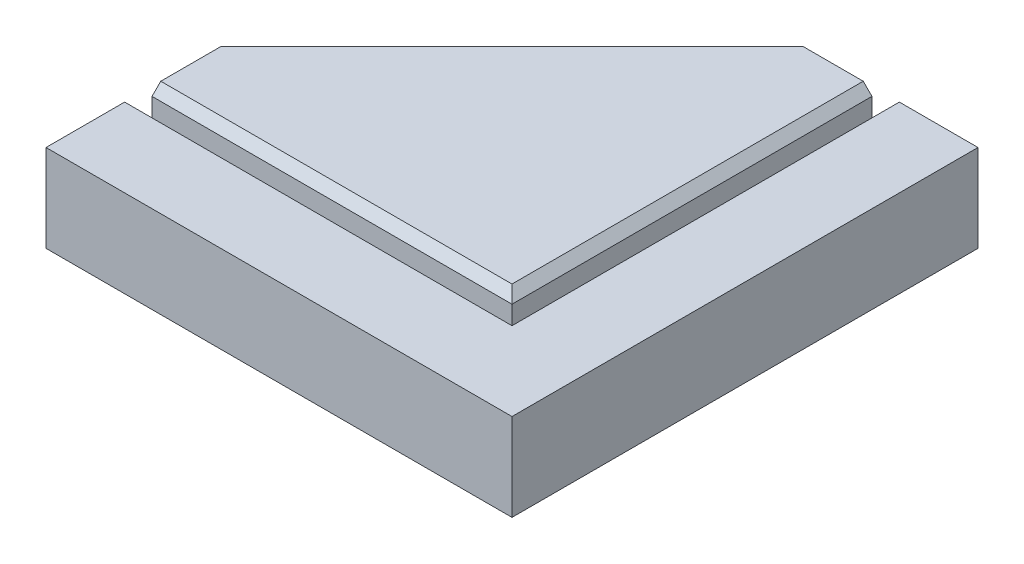
ISO-10303-21;
HEADER;
FILE_DESCRIPTION(('STEP AP214'),'2;1');
FILE_NAME('part.step','',(''),(''),'','','');
FILE_SCHEMA(('AUTOMOTIVE_DESIGN { 1 0 10303 214 1 1 1 1 }'));
ENDSEC;
DATA;
#1=APPLICATION_CONTEXT('core data for automotive mechanical design processes');
#2=APPLICATION_PROTOCOL_DEFINITION('international standard','automotive_design',2000,#1);
#3=PRODUCT_CONTEXT('',#1,'mechanical');
#4=PRODUCT('Part','Part','',(#3));
#5=PRODUCT_RELATED_PRODUCT_CATEGORY('part','',(#4));
#6=PRODUCT_DEFINITION_FORMATION('','',#4);
#7=PRODUCT_DEFINITION_CONTEXT('part definition',#1,'design');
#8=PRODUCT_DEFINITION('design','',#6,#7);
#9=PRODUCT_DEFINITION_SHAPE('','',#8);
#10=(LENGTH_UNIT() NAMED_UNIT(*) SI_UNIT(.MILLI.,.METRE.));
#11=(NAMED_UNIT(*) PLANE_ANGLE_UNIT() SI_UNIT($,.RADIAN.));
#12=(NAMED_UNIT(*) SI_UNIT($,.STERADIAN.) SOLID_ANGLE_UNIT());
#13=UNCERTAINTY_MEASURE_WITH_UNIT(LENGTH_MEASURE(1.E-05),#10,'distance_accuracy_value','');
#14=(GEOMETRIC_REPRESENTATION_CONTEXT(3) GLOBAL_UNCERTAINTY_ASSIGNED_CONTEXT((#13)) GLOBAL_UNIT_ASSIGNED_CONTEXT((#10,
#11,#12)) REPRESENTATION_CONTEXT('',''));
#15=CARTESIAN_POINT('',(0.,0.,0.));
#16=DIRECTION('',(0.,0.,1.));
#17=DIRECTION('',(1.,0.,0.));
#18=AXIS2_PLACEMENT_3D('',#15,#16,#17);
#19=CARTESIAN_POINT('',(0.,15.,0.));
#20=DIRECTION('',(0.,-1.,0.));
#21=DIRECTION('',(0.,0.,-1.));
#22=AXIS2_PLACEMENT_3D('',#19,#20,#21);
#23=PLANE('',#22);
#24=DIRECTION('',(0.,0.,1.));
#25=VECTOR('',#24,1.);
#26=CARTESIAN_POINT('',(66.5,15.,0.));
#27=LINE('',#26,#25);
#28=CARTESIAN_POINT('',(66.5,15.,-80.));
#29=VERTEX_POINT('',#28);
#30=CARTESIAN_POINT('',(66.5,15.,-13.5));
#31=VERTEX_POINT('',#30);
#32=EDGE_CURVE('E203',#29,#31,#27,.T.);
#33=ORIENTED_EDGE('',*,*,#32,.T.);
#34=DIRECTION('',(-1.,0.,0.));
#35=VECTOR('',#34,1.);
#36=CARTESIAN_POINT('',(0.,15.,-13.5));
#37=LINE('',#36,#35);
#38=CARTESIAN_POINT('',(0.,15.,-13.5));
#39=VERTEX_POINT('',#38);
#40=EDGE_CURVE('E206',#31,#39,#37,.T.);
#41=ORIENTED_EDGE('',*,*,#40,.T.);
#42=DIRECTION('',(0.,0.,1.));
#43=VECTOR('',#42,1.);
#44=CARTESIAN_POINT('',(0.,15.,0.));
#45=LINE('',#44,#43);
#46=CARTESIAN_POINT('',(0.,15.,0.));
#47=VERTEX_POINT('',#46);
#48=EDGE_CURVE('E187',#39,#47,#45,.T.);
#49=ORIENTED_EDGE('',*,*,#48,.T.);
#50=DIRECTION('',(1.,0.,0.));
#51=VECTOR('',#50,1.);
#52=CARTESIAN_POINT('',(0.,15.,0.));
#53=LINE('',#52,#51);
#54=CARTESIAN_POINT('',(80.,15.,0.));
#55=VERTEX_POINT('',#54);
#56=EDGE_CURVE('E294',#47,#55,#53,.T.);
#57=ORIENTED_EDGE('',*,*,#56,.T.);
#58=DIRECTION('',(0.,0.,-1.));
#59=VECTOR('',#58,1.);
#60=CARTESIAN_POINT('',(80.,15.,0.));
#61=LINE('',#60,#59);
#62=CARTESIAN_POINT('',(80.,15.,-80.));
#63=VERTEX_POINT('',#62);
#64=EDGE_CURVE('E296',#55,#63,#61,.T.);
#65=ORIENTED_EDGE('',*,*,#64,.T.);
#66=DIRECTION('',(-1.,0.,0.));
#67=VECTOR('',#66,1.);
#68=CARTESIAN_POINT('',(0.,15.,-80.));
#69=LINE('',#68,#67);
#70=EDGE_CURVE('E179',#63,#29,#69,.T.);
#71=ORIENTED_EDGE('',*,*,#70,.T.);
#72=EDGE_LOOP('',(#33,#41,#49,#57,#65,#71));
#73=FACE_BOUND('',#72,.T.);
#74=ADVANCED_FACE('F41',(#73),#23,.F.);
#75=CARTESIAN_POINT('',(0.,15.,0.));
#76=DIRECTION('',(1.,0.,0.));
#77=DIRECTION('',(0.,0.,-1.));
#78=AXIS2_PLACEMENT_3D('',#75,#76,#77);
#79=PLANE('',#78);
#80=CARTESIAN_POINT('',(0.,15.,-30.));
#81=VERTEX_POINT('',#80);
#82=CARTESIAN_POINT('',(0.,15.,-19.7));
#83=VERTEX_POINT('',#82);
#84=EDGE_CURVE('E161',#81,#83,#45,.T.);
#85=ORIENTED_EDGE('',*,*,#84,.F.);
#86=DIRECTION('',(0.,1.,0.));
#87=VECTOR('',#86,1.);
#88=CARTESIAN_POINT('',(0.,0.,-30.));
#89=LINE('',#88,#87);
#90=CARTESIAN_POINT('',(0.,0.,-30.));
#91=VERTEX_POINT('',#90);
#92=EDGE_CURVE('E145',#91,#81,#89,.T.);
#93=ORIENTED_EDGE('',*,*,#92,.F.);
#94=DIRECTION('',(0.,0.,1.));
#95=VECTOR('',#94,1.);
#96=CARTESIAN_POINT('',(0.,0.,0.));
#97=LINE('',#96,#95);
#98=CARTESIAN_POINT('',(0.,0.,0.));
#99=VERTEX_POINT('',#98);
#100=EDGE_CURVE('E158',#91,#99,#97,.T.);
#101=ORIENTED_EDGE('',*,*,#100,.T.);
#102=DIRECTION('',(0.,-1.,0.));
#103=VECTOR('',#102,1.);
#104=CARTESIAN_POINT('',(0.,15.,0.));
#105=LINE('',#104,#103);
#106=EDGE_CURVE('E196',#47,#99,#105,.T.);
#107=ORIENTED_EDGE('',*,*,#106,.F.);
#108=ORIENTED_EDGE('',*,*,#48,.F.);
#109=DIRECTION('',(0.,0.707106781186544,0.707106781186551));
#110=VECTOR('',#109,1.);
#111=CARTESIAN_POINT('',(0.,13.5,-15.));
#112=LINE('',#111,#110);
#113=CARTESIAN_POINT('',(0.,13.5,-15.));
#114=VERTEX_POINT('',#113);
#115=EDGE_CURVE('E212',#39,#114,#112,.F.);
#116=ORIENTED_EDGE('',*,*,#115,.T.);
#117=DIRECTION('',(0.,1.,0.));
#118=VECTOR('',#117,1.);
#119=CARTESIAN_POINT('',(0.,7.,-15.));
#120=LINE('',#119,#118);
#121=CARTESIAN_POINT('',(0.,7.,-15.));
#122=VERTEX_POINT('',#121);
#123=EDGE_CURVE('E176',#122,#114,#120,.T.);
#124=ORIENTED_EDGE('',*,*,#123,.F.);
#125=DIRECTION('',(0.,0.,1.));
#126=VECTOR('',#125,1.);
#127=CARTESIAN_POINT('',(0.,7.,-18.2));
#128=LINE('',#127,#126);
#129=CARTESIAN_POINT('',(0.,7.,-18.2));
#130=VERTEX_POINT('',#129);
#131=EDGE_CURVE('E266',#130,#122,#128,.T.);
#132=ORIENTED_EDGE('',*,*,#131,.F.);
#133=DIRECTION('',(0.,1.,0.));
#134=VECTOR('',#133,1.);
#135=CARTESIAN_POINT('',(0.,7.,-18.2));
#136=LINE('',#135,#134);
#137=CARTESIAN_POINT('',(0.,13.5,-18.2));
#138=VERTEX_POINT('',#137);
#139=EDGE_CURVE('E277',#130,#138,#136,.T.);
#140=ORIENTED_EDGE('',*,*,#139,.T.);
#141=DIRECTION('',(0.,-0.707106781186548,0.707106781186548));
#142=VECTOR('',#141,1.);
#143=CARTESIAN_POINT('',(0.,13.5,-18.2));
#144=LINE('',#143,#142);
#145=EDGE_CURVE('E209',#138,#83,#144,.F.);
#146=ORIENTED_EDGE('',*,*,#145,.T.);
#147=EDGE_LOOP('',(#85,#93,#101,#107,#108,#116,#124,#132,#140,#146));
#148=FACE_BOUND('',#147,.T.);
#149=ADVANCED_FACE('F156',(#148),#79,.F.);
#150=CARTESIAN_POINT('',(0.,15.,0.));
#151=DIRECTION('',(0.,0.,-1.));
#152=DIRECTION('',(-1.,0.,0.));
#153=AXIS2_PLACEMENT_3D('',#150,#151,#152);
#154=PLANE('',#153);
#155=DIRECTION('',(1.,0.,0.));
#156=VECTOR('',#155,1.);
#157=CARTESIAN_POINT('',(0.,0.,0.));
#158=LINE('',#157,#156);
#159=CARTESIAN_POINT('',(80.,0.,0.));
#160=VERTEX_POINT('',#159);
#161=EDGE_CURVE('E166',#99,#160,#158,.T.);
#162=ORIENTED_EDGE('',*,*,#161,.T.);
#163=DIRECTION('',(0.,-1.,0.));
#164=VECTOR('',#163,1.);
#165=CARTESIAN_POINT('',(80.,15.,0.));
#166=LINE('',#165,#164);
#167=EDGE_CURVE('E192',#55,#160,#166,.T.);
#168=ORIENTED_EDGE('',*,*,#167,.F.);
#169=ORIENTED_EDGE('',*,*,#56,.F.);
#170=ORIENTED_EDGE('',*,*,#106,.T.);
#171=EDGE_LOOP('',(#162,#168,#169,#170));
#172=FACE_BOUND('',#171,.T.);
#173=ADVANCED_FACE('F328',(#172),#154,.F.);
#174=CARTESIAN_POINT('',(80.,15.,0.));
#175=DIRECTION('',(-1.,0.,0.));
#176=DIRECTION('',(0.,0.,1.));
#177=AXIS2_PLACEMENT_3D('',#174,#175,#176);
#178=PLANE('',#177);
#179=DIRECTION('',(0.,0.,-1.));
#180=VECTOR('',#179,1.);
#181=CARTESIAN_POINT('',(80.,0.,0.));
#182=LINE('',#181,#180);
#183=CARTESIAN_POINT('',(80.,0.,-80.));
#184=VERTEX_POINT('',#183);
#185=EDGE_CURVE('E173',#160,#184,#182,.T.);
#186=ORIENTED_EDGE('',*,*,#185,.T.);
#187=DIRECTION('',(0.,-1.,0.));
#188=VECTOR('',#187,1.);
#189=CARTESIAN_POINT('',(80.,15.,-80.));
#190=LINE('',#189,#188);
#191=EDGE_CURVE('E188',#63,#184,#190,.T.);
#192=ORIENTED_EDGE('',*,*,#191,.F.);
#193=ORIENTED_EDGE('',*,*,#64,.F.);
#194=ORIENTED_EDGE('',*,*,#167,.T.);
#195=EDGE_LOOP('',(#186,#192,#193,#194));
#196=FACE_BOUND('',#195,.T.);
#197=ADVANCED_FACE('F330',(#196),#178,.F.);
#198=CARTESIAN_POINT('',(0.,15.,-80.));
#199=DIRECTION('',(0.,0.,1.));
#200=DIRECTION('',(1.,0.,0.));
#201=AXIS2_PLACEMENT_3D('',#198,#199,#200);
#202=PLANE('',#201);
#203=DIRECTION('',(-1.,0.,0.));
#204=VECTOR('',#203,1.);
#205=CARTESIAN_POINT('',(0.,0.,-80.));
#206=LINE('',#205,#204);
#207=CARTESIAN_POINT('',(50.,0.,-80.));
#208=VERTEX_POINT('',#207);
#209=EDGE_CURVE('E184',#184,#208,#206,.T.);
#210=ORIENTED_EDGE('',*,*,#209,.T.);
#211=DIRECTION('',(0.,1.,0.));
#212=VECTOR('',#211,1.);
#213=CARTESIAN_POINT('',(50.,0.,-80.));
#214=LINE('',#213,#212);
#215=CARTESIAN_POINT('',(50.,15.,-80.));
#216=VERTEX_POINT('',#215);
#217=EDGE_CURVE('E60',#208,#216,#214,.T.);
#218=ORIENTED_EDGE('',*,*,#217,.T.);
#219=CARTESIAN_POINT('',(60.3,15.,-80.));
#220=VERTEX_POINT('',#219);
#221=EDGE_CURVE('E298',#220,#216,#69,.T.);
#222=ORIENTED_EDGE('',*,*,#221,.F.);
#223=DIRECTION('',(-0.707106781186546,0.707106781186549,0.));
#224=VECTOR('',#223,1.);
#225=CARTESIAN_POINT('',(61.8,13.5,-80.));
#226=LINE('',#225,#224);
#227=CARTESIAN_POINT('',(61.8,13.5,-80.));
#228=VERTEX_POINT('',#227);
#229=EDGE_CURVE('E218',#220,#228,#226,.F.);
#230=ORIENTED_EDGE('',*,*,#229,.T.);
#231=DIRECTION('',(0.,1.,0.));
#232=VECTOR('',#231,1.);
#233=CARTESIAN_POINT('',(61.8,7.,-80.));
#234=LINE('',#233,#232);
#235=CARTESIAN_POINT('',(61.8,7.,-80.));
#236=VERTEX_POINT('',#235);
#237=EDGE_CURVE('E285',#236,#228,#234,.T.);
#238=ORIENTED_EDGE('',*,*,#237,.F.);
#239=DIRECTION('',(-1.,0.,0.));
#240=VECTOR('',#239,1.);
#241=CARTESIAN_POINT('',(65.,7.,-80.));
#242=LINE('',#241,#240);
#243=CARTESIAN_POINT('',(65.,7.,-80.));
#244=VERTEX_POINT('',#243);
#245=EDGE_CURVE('E242',#244,#236,#242,.T.);
#246=ORIENTED_EDGE('',*,*,#245,.F.);
#247=DIRECTION('',(0.,1.,0.));
#248=VECTOR('',#247,1.);
#249=CARTESIAN_POINT('',(65.,7.,-80.));
#250=LINE('',#249,#248);
#251=CARTESIAN_POINT('',(65.,13.5,-80.));
#252=VERTEX_POINT('',#251);
#253=EDGE_CURVE('E272',#244,#252,#250,.T.);
#254=ORIENTED_EDGE('',*,*,#253,.T.);
#255=DIRECTION('',(-0.707106781186553,-0.707106781186542,0.));
#256=VECTOR('',#255,1.);
#257=CARTESIAN_POINT('',(65.,13.5,-80.));
#258=LINE('',#257,#256);
#259=EDGE_CURVE('E221',#252,#29,#258,.F.);
#260=ORIENTED_EDGE('',*,*,#259,.T.);
#261=ORIENTED_EDGE('',*,*,#70,.F.);
#262=ORIENTED_EDGE('',*,*,#191,.T.);
#263=EDGE_LOOP('',(#210,#218,#222,#230,#238,#246,#254,#260,#261,#262));
#264=FACE_BOUND('',#263,.T.);
#265=ADVANCED_FACE('F331',(#264),#202,.F.);
#266=ORIENTED_EDGE('',*,*,#221,.T.);
#267=DIRECTION('',(0.707106781186547,0.,-0.707106781186548));
#268=VECTOR('',#267,1.);
#269=CARTESIAN_POINT('',(50.,15.,-80.));
#270=LINE('',#269,#268);
#271=EDGE_CURVE('E152',#81,#216,#270,.T.);
#272=ORIENTED_EDGE('',*,*,#271,.F.);
#273=ORIENTED_EDGE('',*,*,#84,.T.);
#274=DIRECTION('',(1.,0.,0.));
#275=VECTOR('',#274,1.);
#276=CARTESIAN_POINT('',(0.,15.,-19.7));
#277=LINE('',#276,#275);
#278=CARTESIAN_POINT('',(60.3,15.,-19.7));
#279=VERTEX_POINT('',#278);
#280=EDGE_CURVE('E68',#83,#279,#277,.T.);
#281=ORIENTED_EDGE('',*,*,#280,.T.);
#282=DIRECTION('',(0.,0.,-1.));
#283=VECTOR('',#282,1.);
#284=CARTESIAN_POINT('',(60.3,15.,0.));
#285=LINE('',#284,#283);
#286=EDGE_CURVE('E52',#279,#220,#285,.T.);
#287=ORIENTED_EDGE('',*,*,#286,.T.);
#288=EDGE_LOOP('',(#266,#272,#273,#281,#287));
#289=FACE_BOUND('',#288,.T.);
#290=ADVANCED_FACE('F333',(#289),#23,.F.);
#291=CARTESIAN_POINT('',(0.,0.,0.));
#292=DIRECTION('',(0.,-1.,0.));
#293=DIRECTION('',(0.,0.,-1.));
#294=AXIS2_PLACEMENT_3D('',#291,#292,#293);
#295=PLANE('',#294);
#296=DIRECTION('',(0.707106781186547,0.,-0.707106781186548));
#297=VECTOR('',#296,1.);
#298=CARTESIAN_POINT('',(50.,0.,-80.));
#299=LINE('',#298,#297);
#300=EDGE_CURVE('E142',#91,#208,#299,.T.);
#301=ORIENTED_EDGE('',*,*,#300,.T.);
#302=ORIENTED_EDGE('',*,*,#209,.F.);
#303=ORIENTED_EDGE('',*,*,#185,.F.);
#304=ORIENTED_EDGE('',*,*,#161,.F.);
#305=ORIENTED_EDGE('',*,*,#100,.F.);
#306=EDGE_LOOP('',(#301,#302,#303,#304,#305));
#307=FACE_BOUND('',#306,.T.);
#308=ADVANCED_FACE('F164',(#307),#295,.T.);
#309=CARTESIAN_POINT('',(65.,7.,-80.));
#310=DIRECTION('',(1.,0.,0.));
#311=DIRECTION('',(0.,0.,-1.));
#312=AXIS2_PLACEMENT_3D('',#309,#310,#311);
#313=PLANE('',#312);
#314=DIRECTION('',(0.,1.,0.));
#315=VECTOR('',#314,1.);
#316=CARTESIAN_POINT('',(65.,7.,-15.));
#317=LINE('',#316,#315);
#318=CARTESIAN_POINT('',(65.,7.,-15.));
#319=VERTEX_POINT('',#318);
#320=CARTESIAN_POINT('',(65.,13.5,-15.));
#321=VERTEX_POINT('',#320);
#322=EDGE_CURVE('E169',#319,#321,#317,.T.);
#323=ORIENTED_EDGE('',*,*,#322,.T.);
#324=DIRECTION('',(0.,0.,-1.));
#325=VECTOR('',#324,1.);
#326=CARTESIAN_POINT('',(65.,13.5,-80.));
#327=LINE('',#326,#325);
#328=EDGE_CURVE('E215',#321,#252,#327,.T.);
#329=ORIENTED_EDGE('',*,*,#328,.T.);
#330=ORIENTED_EDGE('',*,*,#253,.F.);
#331=DIRECTION('',(0.,0.,-1.));
#332=VECTOR('',#331,1.);
#333=CARTESIAN_POINT('',(65.,7.,-80.));
#334=LINE('',#333,#332);
#335=EDGE_CURVE('E233',#319,#244,#334,.T.);
#336=ORIENTED_EDGE('',*,*,#335,.F.);
#337=EDGE_LOOP('',(#323,#329,#330,#336));
#338=FACE_BOUND('',#337,.T.);
#339=ADVANCED_FACE('F317',(#338),#313,.F.);
#340=CARTESIAN_POINT('',(65.,7.,-15.));
#341=DIRECTION('',(0.,0.,1.));
#342=DIRECTION('',(1.,0.,0.));
#343=AXIS2_PLACEMENT_3D('',#340,#341,#342);
#344=PLANE('',#343);
#345=ORIENTED_EDGE('',*,*,#123,.T.);
#346=DIRECTION('',(1.,0.,0.));
#347=VECTOR('',#346,1.);
#348=CARTESIAN_POINT('',(65.,13.5,-15.));
#349=LINE('',#348,#347);
#350=EDGE_CURVE('E199',#114,#321,#349,.T.);
#351=ORIENTED_EDGE('',*,*,#350,.T.);
#352=ORIENTED_EDGE('',*,*,#322,.F.);
#353=DIRECTION('',(1.,0.,0.));
#354=VECTOR('',#353,1.);
#355=CARTESIAN_POINT('',(65.,7.,-15.));
#356=LINE('',#355,#354);
#357=EDGE_CURVE('E269',#122,#319,#356,.T.);
#358=ORIENTED_EDGE('',*,*,#357,.F.);
#359=EDGE_LOOP('',(#345,#351,#352,#358));
#360=FACE_BOUND('',#359,.T.);
#361=ADVANCED_FACE('F312',(#360),#344,.F.);
#362=CARTESIAN_POINT('',(61.8,7.,-18.2));
#363=DIRECTION('',(0.,0.,-1.));
#364=DIRECTION('',(-1.,0.,0.));
#365=AXIS2_PLACEMENT_3D('',#362,#363,#364);
#366=PLANE('',#365);
#367=DIRECTION('',(0.,1.,0.));
#368=VECTOR('',#367,1.);
#369=CARTESIAN_POINT('',(61.8,7.,-18.2));
#370=LINE('',#369,#368);
#371=CARTESIAN_POINT('',(61.8,7.,-18.2));
#372=VERTEX_POINT('',#371);
#373=CARTESIAN_POINT('',(61.8,13.5,-18.2));
#374=VERTEX_POINT('',#373);
#375=EDGE_CURVE('E281',#372,#374,#370,.T.);
#376=ORIENTED_EDGE('',*,*,#375,.T.);
#377=DIRECTION('',(-1.,0.,0.));
#378=VECTOR('',#377,1.);
#379=CARTESIAN_POINT('',(61.8,13.5,-18.2));
#380=LINE('',#379,#378);
#381=EDGE_CURVE('E11',#374,#138,#380,.T.);
#382=ORIENTED_EDGE('',*,*,#381,.T.);
#383=ORIENTED_EDGE('',*,*,#139,.F.);
#384=DIRECTION('',(-1.,0.,0.));
#385=VECTOR('',#384,1.);
#386=CARTESIAN_POINT('',(61.8,7.,-18.2));
#387=LINE('',#386,#385);
#388=EDGE_CURVE('E262',#372,#130,#387,.T.);
#389=ORIENTED_EDGE('',*,*,#388,.F.);
#390=EDGE_LOOP('',(#376,#382,#383,#389));
#391=FACE_BOUND('',#390,.T.);
#392=ADVANCED_FACE('F356',(#391),#366,.F.);
#393=CARTESIAN_POINT('',(61.8,7.,-80.));
#394=DIRECTION('',(-1.,0.,0.));
#395=DIRECTION('',(0.,0.,1.));
#396=AXIS2_PLACEMENT_3D('',#393,#394,#395);
#397=PLANE('',#396);
#398=ORIENTED_EDGE('',*,*,#237,.T.);
#399=DIRECTION('',(0.,0.,1.));
#400=VECTOR('',#399,1.);
#401=CARTESIAN_POINT('',(61.8,13.5,-80.));
#402=LINE('',#401,#400);
#403=EDGE_CURVE('E224',#228,#374,#402,.T.);
#404=ORIENTED_EDGE('',*,*,#403,.T.);
#405=ORIENTED_EDGE('',*,*,#375,.F.);
#406=DIRECTION('',(0.,0.,1.));
#407=VECTOR('',#406,1.);
#408=CARTESIAN_POINT('',(61.8,7.,-80.));
#409=LINE('',#408,#407);
#410=EDGE_CURVE('E258',#236,#372,#409,.T.);
#411=ORIENTED_EDGE('',*,*,#410,.F.);
#412=EDGE_LOOP('',(#398,#404,#405,#411));
#413=FACE_BOUND('',#412,.T.);
#414=ADVANCED_FACE('F361',(#413),#397,.F.);
#415=CARTESIAN_POINT('',(0.,7.,0.));
#416=DIRECTION('',(0.,-1.,0.));
#417=DIRECTION('',(0.,0.,-1.));
#418=AXIS2_PLACEMENT_3D('',#415,#416,#417);
#419=PLANE('',#418);
#420=ORIENTED_EDGE('',*,*,#335,.T.);
#421=ORIENTED_EDGE('',*,*,#245,.T.);
#422=ORIENTED_EDGE('',*,*,#410,.T.);
#423=ORIENTED_EDGE('',*,*,#388,.T.);
#424=ORIENTED_EDGE('',*,*,#131,.T.);
#425=ORIENTED_EDGE('',*,*,#357,.T.);
#426=EDGE_LOOP('',(#420,#421,#422,#423,#424,#425));
#427=FACE_BOUND('',#426,.T.);
#428=ADVANCED_FACE('F320',(#427),#419,.F.);
#429=CARTESIAN_POINT('',(65.,13.5,-80.));
#430=DIRECTION('',(0.707106781186542,-0.707106781186553,0.));
#431=DIRECTION('',(0.,0.,-1.));
#432=AXIS2_PLACEMENT_3D('',#429,#430,#431);
#433=PLANE('',#432);
#434=ORIENTED_EDGE('',*,*,#259,.F.);
#435=ORIENTED_EDGE('',*,*,#328,.F.);
#436=DIRECTION('',(0.57735026918963,0.577350269189621,0.577350269189626));
#437=VECTOR('',#436,1.);
#438=CARTESIAN_POINT('',(65.,13.5,-15.));
#439=LINE('',#438,#437);
#440=EDGE_CURVE('E231',#31,#321,#439,.F.);
#441=ORIENTED_EDGE('',*,*,#440,.F.);
#442=ORIENTED_EDGE('',*,*,#32,.F.);
#443=EDGE_LOOP('',(#434,#435,#441,#442));
#444=FACE_BOUND('',#443,.T.);
#445=ADVANCED_FACE('F309',(#444),#433,.F.);
#446=CARTESIAN_POINT('',(65.,13.5,-15.));
#447=DIRECTION('',(0.,-0.707106781186551,0.707106781186544));
#448=DIRECTION('',(1.,0.,0.));
#449=AXIS2_PLACEMENT_3D('',#446,#447,#448);
#450=PLANE('',#449);
#451=ORIENTED_EDGE('',*,*,#115,.F.);
#452=ORIENTED_EDGE('',*,*,#40,.F.);
#453=ORIENTED_EDGE('',*,*,#440,.T.);
#454=ORIENTED_EDGE('',*,*,#350,.F.);
#455=EDGE_LOOP('',(#451,#452,#453,#454));
#456=FACE_BOUND('',#455,.T.);
#457=ADVANCED_FACE('F323',(#456),#450,.F.);
#458=CARTESIAN_POINT('',(61.8,13.5,-18.2));
#459=DIRECTION('',(0.,-0.707106781186547,-0.707106781186547));
#460=DIRECTION('',(-1.,0.,0.));
#461=AXIS2_PLACEMENT_3D('',#458,#459,#460);
#462=PLANE('',#461);
#463=ORIENTED_EDGE('',*,*,#145,.F.);
#464=ORIENTED_EDGE('',*,*,#381,.F.);
#465=DIRECTION('',(-0.577350269189625,0.577350269189626,-0.577350269189626));
#466=VECTOR('',#465,1.);
#467=CARTESIAN_POINT('',(61.8,13.5,-18.2));
#468=LINE('',#467,#466);
#469=EDGE_CURVE('E46',#279,#374,#468,.F.);
#470=ORIENTED_EDGE('',*,*,#469,.F.);
#471=ORIENTED_EDGE('',*,*,#280,.F.);
#472=EDGE_LOOP('',(#463,#464,#470,#471));
#473=FACE_BOUND('',#472,.T.);
#474=ADVANCED_FACE('F44',(#473),#462,.F.);
#475=CARTESIAN_POINT('',(61.8,13.5,-80.));
#476=DIRECTION('',(-0.707106781186549,-0.707106781186546,0.));
#477=DIRECTION('',(0.,0.,1.));
#478=AXIS2_PLACEMENT_3D('',#475,#476,#477);
#479=PLANE('',#478);
#480=ORIENTED_EDGE('',*,*,#229,.F.);
#481=ORIENTED_EDGE('',*,*,#286,.F.);
#482=ORIENTED_EDGE('',*,*,#469,.T.);
#483=ORIENTED_EDGE('',*,*,#403,.F.);
#484=EDGE_LOOP('',(#480,#481,#482,#483));
#485=FACE_BOUND('',#484,.T.);
#486=ADVANCED_FACE('F373',(#485),#479,.F.);
#487=CARTESIAN_POINT('',(50.,0.,-80.));
#488=DIRECTION('',(0.707106781186548,0.,0.707106781186547));
#489=DIRECTION('',(0.707106781186547,0.,-0.707106781186548));
#490=AXIS2_PLACEMENT_3D('',#487,#488,#489);
#491=PLANE('',#490);
#492=ORIENTED_EDGE('',*,*,#271,.T.);
#493=ORIENTED_EDGE('',*,*,#217,.F.);
#494=ORIENTED_EDGE('',*,*,#300,.F.);
#495=ORIENTED_EDGE('',*,*,#92,.T.);
#496=EDGE_LOOP('',(#492,#493,#494,#495));
#497=FACE_BOUND('',#496,.T.);
#498=ADVANCED_FACE('F144',(#497),#491,.F.);
#499=CLOSED_SHELL('',(#74,#149,#173,#197,#265,#290,#308,#339,#361,#392,#414,#428,#445,#457,#474,
#486,#498));
#500=MANIFOLD_SOLID_BREP('B2',#499);
#501=ADVANCED_BREP_SHAPE_REPRESENTATION('',(#18,#500),#14);
#502=SHAPE_DEFINITION_REPRESENTATION(#9,#501);
ENDSEC;
END-ISO-10303-21;
